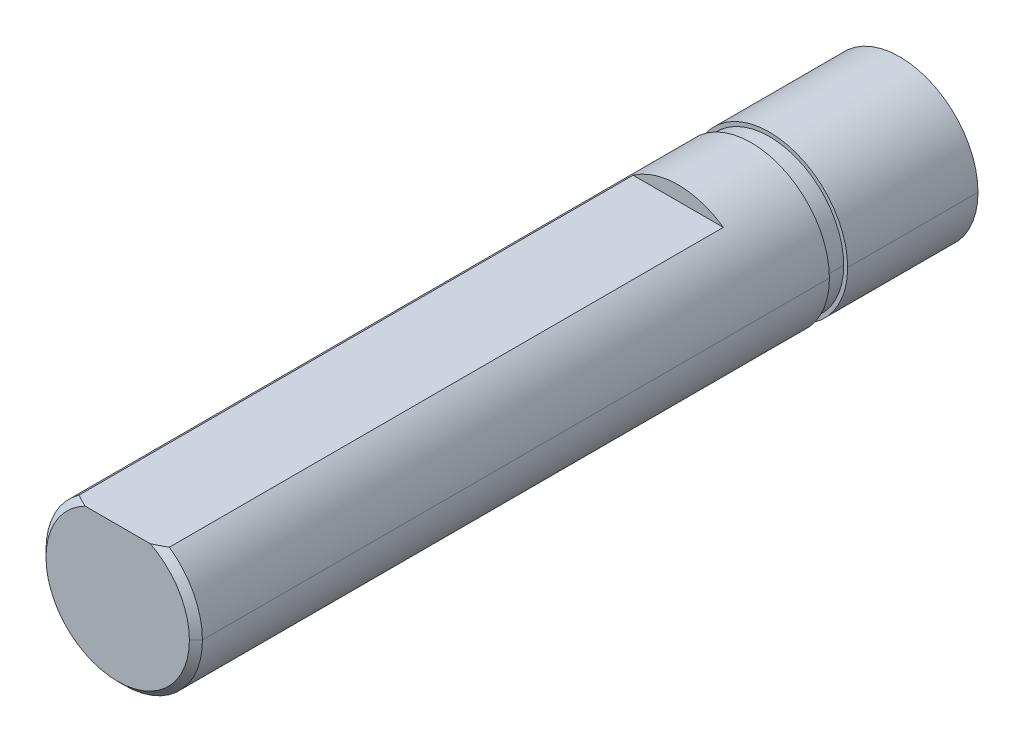
ISO-10303-21;
HEADER;
FILE_DESCRIPTION(('STEP AP214'),'2;1');
FILE_NAME('part.step','',(''),(''),'','','');
FILE_SCHEMA(('AUTOMOTIVE_DESIGN { 1 0 10303 214 1 1 1 1 }'));
ENDSEC;
DATA;
#1=APPLICATION_CONTEXT('core data for automotive mechanical design processes');
#2=APPLICATION_PROTOCOL_DEFINITION('international standard','automotive_design',2000,#1);
#3=PRODUCT_CONTEXT('',#1,'mechanical');
#4=PRODUCT('Part','Part','',(#3));
#5=PRODUCT_RELATED_PRODUCT_CATEGORY('part','',(#4));
#6=PRODUCT_DEFINITION_FORMATION('','',#4);
#7=PRODUCT_DEFINITION_CONTEXT('part definition',#1,'design');
#8=PRODUCT_DEFINITION('design','',#6,#7);
#9=PRODUCT_DEFINITION_SHAPE('','',#8);
#10=(LENGTH_UNIT() NAMED_UNIT(*) SI_UNIT(.MILLI.,.METRE.));
#11=(NAMED_UNIT(*) PLANE_ANGLE_UNIT() SI_UNIT($,.RADIAN.));
#12=(NAMED_UNIT(*) SI_UNIT($,.STERADIAN.) SOLID_ANGLE_UNIT());
#13=UNCERTAINTY_MEASURE_WITH_UNIT(LENGTH_MEASURE(1.E-05),#10,'distance_accuracy_value','');
#14=(GEOMETRIC_REPRESENTATION_CONTEXT(3) GLOBAL_UNCERTAINTY_ASSIGNED_CONTEXT((#13)) GLOBAL_UNIT_ASSIGNED_CONTEXT((#10,
#11,#12)) REPRESENTATION_CONTEXT('',''));
#15=CARTESIAN_POINT('',(0.,0.,0.));
#16=DIRECTION('',(0.,0.,1.));
#17=DIRECTION('',(1.,0.,0.));
#18=AXIS2_PLACEMENT_3D('',#15,#16,#17);
#19=CARTESIAN_POINT('',(0.,0.,30.));
#20=DIRECTION('',(0.,0.,-1.));
#21=DIRECTION('',(-1.,0.,0.));
#22=AXIS2_PLACEMENT_3D('',#19,#20,#21);
#23=CYLINDRICAL_SURFACE('',#22,3.);
#24=CARTESIAN_POINT('',(0.,0.,5.));
#25=DIRECTION('',(0.,0.,-1.));
#26=DIRECTION('',(-1.,0.,0.));
#27=AXIS2_PLACEMENT_3D('',#24,#25,#26);
#28=CIRCLE('',#27,3.);
#29=CARTESIAN_POINT('',(-3.,0.,5.));
#30=VERTEX_POINT('',#29);
#31=CARTESIAN_POINT('',(3.,0.,5.));
#32=VERTEX_POINT('',#31);
#33=EDGE_CURVE('E11',#30,#32,#28,.T.);
#34=ORIENTED_EDGE('',*,*,#33,.T.);
#35=DIRECTION('',(0.,0.,-1.));
#36=VECTOR('',#35,1.);
#37=CARTESIAN_POINT('',(3.,0.,30.));
#38=LINE('',#37,#36);
#39=CARTESIAN_POINT('',(3.,0.,0.));
#40=VERTEX_POINT('',#39);
#41=EDGE_CURVE('E27',#32,#40,#38,.T.);
#42=ORIENTED_EDGE('',*,*,#41,.T.);
#43=CARTESIAN_POINT('',(0.,0.,0.));
#44=DIRECTION('',(0.,0.,1.));
#45=DIRECTION('',(1.,0.,0.));
#46=AXIS2_PLACEMENT_3D('',#43,#44,#45);
#47=CIRCLE('',#46,3.);
#48=CARTESIAN_POINT('',(-3.,0.,0.));
#49=VERTEX_POINT('',#48);
#50=EDGE_CURVE('E159',#40,#49,#47,.T.);
#51=ORIENTED_EDGE('',*,*,#50,.T.);
#52=DIRECTION('',(0.,0.,-1.));
#53=VECTOR('',#52,1.);
#54=CARTESIAN_POINT('',(-3.,0.,30.));
#55=LINE('',#54,#53);
#56=EDGE_CURVE('E134',#30,#49,#55,.T.);
#57=ORIENTED_EDGE('',*,*,#56,.F.);
#58=EDGE_LOOP('',(#34,#42,#51,#57));
#59=FACE_BOUND('',#58,.T.);
#60=ADVANCED_FACE('F16',(#59),#23,.T.);
#61=CARTESIAN_POINT('',(0.,0.,0.));
#62=DIRECTION('',(0.,0.,1.));
#63=DIRECTION('',(1.,0.,0.));
#64=AXIS2_PLACEMENT_3D('',#61,#62,#63);
#65=CYLINDRICAL_SURFACE('',#64,2.85);
#66=CARTESIAN_POINT('',(0.,0.,5.));
#67=DIRECTION('',(0.,0.,1.));
#68=DIRECTION('',(1.,0.,0.));
#69=AXIS2_PLACEMENT_3D('',#66,#67,#68);
#70=CIRCLE('',#69,2.85);
#71=CARTESIAN_POINT('',(2.85,0.,5.));
#72=VERTEX_POINT('',#71);
#73=CARTESIAN_POINT('',(-2.85,0.,5.));
#74=VERTEX_POINT('',#73);
#75=EDGE_CURVE('E163',#72,#74,#70,.T.);
#76=ORIENTED_EDGE('',*,*,#75,.T.);
#77=DIRECTION('',(0.,0.,1.));
#78=VECTOR('',#77,1.);
#79=CARTESIAN_POINT('',(-2.85,0.,0.));
#80=LINE('',#79,#78);
#81=CARTESIAN_POINT('',(-2.85,0.,5.7));
#82=VERTEX_POINT('',#81);
#83=EDGE_CURVE('E116',#74,#82,#80,.T.);
#84=ORIENTED_EDGE('',*,*,#83,.T.);
#85=CARTESIAN_POINT('',(0.,0.,5.7));
#86=DIRECTION('',(0.,0.,1.));
#87=DIRECTION('',(1.,0.,0.));
#88=AXIS2_PLACEMENT_3D('',#85,#86,#87);
#89=CIRCLE('',#88,2.85);
#90=CARTESIAN_POINT('',(2.85,0.,5.7));
#91=VERTEX_POINT('',#90);
#92=EDGE_CURVE('E114',#91,#82,#89,.T.);
#93=ORIENTED_EDGE('',*,*,#92,.F.);
#94=DIRECTION('',(0.,0.,1.));
#95=VECTOR('',#94,1.);
#96=CARTESIAN_POINT('',(2.85,0.,0.));
#97=LINE('',#96,#95);
#98=EDGE_CURVE('E100',#72,#91,#97,.T.);
#99=ORIENTED_EDGE('',*,*,#98,.F.);
#100=EDGE_LOOP('',(#76,#84,#93,#99));
#101=FACE_BOUND('',#100,.T.);
#102=ADVANCED_FACE('F115',(#101),#65,.T.);
#103=CARTESIAN_POINT('',(0.,0.,30.));
#104=DIRECTION('',(0.,0.,-1.));
#105=DIRECTION('',(-1.,0.,0.));
#106=AXIS2_PLACEMENT_3D('',#103,#104,#105);
#107=CONICAL_SURFACE('',#106,2.75,0.78539816339745);
#108=CARTESIAN_POINT('',(0.,0.,30.));
#109=DIRECTION('',(0.,0.,1.));
#110=DIRECTION('',(1.,0.,0.));
#111=AXIS2_PLACEMENT_3D('',#108,#109,#110);
#112=CIRCLE('',#111,2.75);
#113=CARTESIAN_POINT('',(2.75,0.,30.));
#114=VERTEX_POINT('',#113);
#115=CARTESIAN_POINT('',(1.24899959967967,2.45,30.));
#116=VERTEX_POINT('',#115);
#117=EDGE_CURVE('E156',#114,#116,#112,.T.);
#118=ORIENTED_EDGE('',*,*,#117,.F.);
#119=DIRECTION('',(0.707106781186549,0.,-0.707106781186546));
#120=VECTOR('',#119,1.);
#121=CARTESIAN_POINT('',(2.75,0.,30.));
#122=LINE('',#121,#120);
#123=CARTESIAN_POINT('',(3.,0.,29.75));
#124=VERTEX_POINT('',#123);
#125=EDGE_CURVE('E141',#114,#124,#122,.T.);
#126=ORIENTED_EDGE('',*,*,#125,.T.);
#127=CARTESIAN_POINT('',(0.,0.,29.75));
#128=DIRECTION('',(0.,0.,-1.));
#129=DIRECTION('',(1.,0.,0.));
#130=AXIS2_PLACEMENT_3D('',#127,#128,#129);
#131=CIRCLE('',#130,3.);
#132=CARTESIAN_POINT('',(1.73132896931808,2.45,29.75));
#133=VERTEX_POINT('',#132);
#134=EDGE_CURVE('E142',#133,#124,#131,.T.);
#135=ORIENTED_EDGE('',*,*,#134,.F.);
#136=CARTESIAN_POINT('',(1.24899959967967,2.45,30.));
#137=CARTESIAN_POINT('',(1.47967886341983,2.45,29.8952297061578));
#138=CARTESIAN_POINT('',(1.73132896931808,2.45,29.75));
#139=B_SPLINE_CURVE_WITH_KNOTS('',2,(#136,#137,#138),.UNSPECIFIED.,.F.,.F.,(3,3),(0.,1.),.UNSPECIFIED.);
#140=EDGE_CURVE('E188',#116,#133,#139,.T.);
#141=ORIENTED_EDGE('',*,*,#140,.F.);
#142=EDGE_LOOP('',(#118,#126,#135,#141));
#143=FACE_BOUND('',#142,.T.);
#144=ADVANCED_FACE('F330',(#143),#107,.T.);
#145=CARTESIAN_POINT('',(0.,0.,30.));
#146=DIRECTION('',(0.,0.,-1.));
#147=DIRECTION('',(-1.,0.,0.));
#148=AXIS2_PLACEMENT_3D('',#145,#146,#147);
#149=CONICAL_SURFACE('',#148,2.75,0.78539816339745);
#150=ORIENTED_EDGE('',*,*,#125,.F.);
#151=CARTESIAN_POINT('',(0.,0.,30.));
#152=DIRECTION('',(0.,0.,1.));
#153=DIRECTION('',(1.,0.,0.));
#154=AXIS2_PLACEMENT_3D('',#151,#152,#153);
#155=CIRCLE('',#154,2.75);
#156=CARTESIAN_POINT('',(-2.75,0.,30.));
#157=VERTEX_POINT('',#156);
#158=EDGE_CURVE('E152',#157,#114,#155,.T.);
#159=ORIENTED_EDGE('',*,*,#158,.F.);
#160=DIRECTION('',(-0.707106781186549,0.,-0.707106781186546));
#161=VECTOR('',#160,1.);
#162=CARTESIAN_POINT('',(-2.75,0.,30.));
#163=LINE('',#162,#161);
#164=CARTESIAN_POINT('',(-3.,0.,29.75));
#165=VERTEX_POINT('',#164);
#166=EDGE_CURVE('E138',#157,#165,#163,.T.);
#167=ORIENTED_EDGE('',*,*,#166,.T.);
#168=CARTESIAN_POINT('',(0.,0.,29.75));
#169=DIRECTION('',(0.,0.,-1.));
#170=DIRECTION('',(1.,0.,0.));
#171=AXIS2_PLACEMENT_3D('',#168,#169,#170);
#172=CIRCLE('',#171,3.);
#173=EDGE_CURVE('E174',#124,#165,#172,.T.);
#174=ORIENTED_EDGE('',*,*,#173,.F.);
#175=EDGE_LOOP('',(#150,#159,#167,#174));
#176=FACE_BOUND('',#175,.T.);
#177=ADVANCED_FACE('F18',(#176),#149,.T.);
#178=CARTESIAN_POINT('',(0.,0.,30.));
#179=DIRECTION('',(0.,0.,-1.));
#180=DIRECTION('',(-1.,0.,0.));
#181=AXIS2_PLACEMENT_3D('',#178,#179,#180);
#182=CYLINDRICAL_SURFACE('',#181,3.);
#183=ORIENTED_EDGE('',*,*,#134,.T.);
#184=DIRECTION('',(0.,0.,-1.));
#185=VECTOR('',#184,1.);
#186=CARTESIAN_POINT('',(3.,0.,30.));
#187=LINE('',#186,#185);
#188=CARTESIAN_POINT('',(3.,0.,5.7));
#189=VERTEX_POINT('',#188);
#190=EDGE_CURVE('E166',#124,#189,#187,.T.);
#191=ORIENTED_EDGE('',*,*,#190,.T.);
#192=CARTESIAN_POINT('',(0.,0.,5.7));
#193=DIRECTION('',(0.,0.,1.));
#194=DIRECTION('',(1.,0.,0.));
#195=AXIS2_PLACEMENT_3D('',#192,#193,#194);
#196=CIRCLE('',#195,3.);
#197=CARTESIAN_POINT('',(-3.,0.,5.7));
#198=VERTEX_POINT('',#197);
#199=EDGE_CURVE('E170',#189,#198,#196,.T.);
#200=ORIENTED_EDGE('',*,*,#199,.T.);
#201=DIRECTION('',(0.,0.,-1.));
#202=VECTOR('',#201,1.);
#203=CARTESIAN_POINT('',(-3.,0.,30.));
#204=LINE('',#203,#202);
#205=EDGE_CURVE('E149',#165,#198,#204,.T.);
#206=ORIENTED_EDGE('',*,*,#205,.F.);
#207=CARTESIAN_POINT('',(0.,0.,29.75));
#208=DIRECTION('',(0.,0.,-1.));
#209=DIRECTION('',(1.,0.,0.));
#210=AXIS2_PLACEMENT_3D('',#207,#208,#209);
#211=CIRCLE('',#210,3.);
#212=CARTESIAN_POINT('',(-1.73132896931808,2.45,29.75));
#213=VERTEX_POINT('',#212);
#214=EDGE_CURVE('E181',#165,#213,#211,.T.);
#215=ORIENTED_EDGE('',*,*,#214,.T.);
#216=DIRECTION('',(0.,0.,1.));
#217=VECTOR('',#216,1.);
#218=CARTESIAN_POINT('',(-1.73132896931808,2.45,8.5));
#219=LINE('',#218,#217);
#220=CARTESIAN_POINT('',(-1.73132896931808,2.45,8.5));
#221=VERTEX_POINT('',#220);
#222=EDGE_CURVE('E234',#221,#213,#219,.T.);
#223=ORIENTED_EDGE('',*,*,#222,.F.);
#224=CARTESIAN_POINT('',(0.,0.,8.5));
#225=DIRECTION('',(0.,0.,1.));
#226=DIRECTION('',(1.,0.,0.));
#227=AXIS2_PLACEMENT_3D('',#224,#225,#226);
#228=CIRCLE('',#227,3.);
#229=CARTESIAN_POINT('',(1.73132896931808,2.45,8.5));
#230=VERTEX_POINT('',#229);
#231=EDGE_CURVE('E132',#230,#221,#228,.T.);
#232=ORIENTED_EDGE('',*,*,#231,.F.);
#233=DIRECTION('',(0.,0.,1.));
#234=VECTOR('',#233,1.);
#235=CARTESIAN_POINT('',(1.73132896931808,2.45,8.5));
#236=LINE('',#235,#234);
#237=EDGE_CURVE('E247',#230,#133,#236,.T.);
#238=ORIENTED_EDGE('',*,*,#237,.T.);
#239=EDGE_LOOP('',(#183,#191,#200,#206,#215,#223,#232,#238));
#240=FACE_BOUND('',#239,.T.);
#241=ADVANCED_FACE('F207',(#240),#182,.T.);
#242=CARTESIAN_POINT('',(0.,0.,30.));
#243=DIRECTION('',(0.,0.,-1.));
#244=DIRECTION('',(-1.,0.,0.));
#245=AXIS2_PLACEMENT_3D('',#242,#243,#244);
#246=CYLINDRICAL_SURFACE('',#245,3.);
#247=ORIENTED_EDGE('',*,*,#190,.F.);
#248=ORIENTED_EDGE('',*,*,#173,.T.);
#249=ORIENTED_EDGE('',*,*,#205,.T.);
#250=CARTESIAN_POINT('',(0.,0.,5.7));
#251=DIRECTION('',(0.,0.,1.));
#252=DIRECTION('',(1.,0.,0.));
#253=AXIS2_PLACEMENT_3D('',#250,#251,#252);
#254=CIRCLE('',#253,3.);
#255=EDGE_CURVE('E146',#198,#189,#254,.T.);
#256=ORIENTED_EDGE('',*,*,#255,.T.);
#257=EDGE_LOOP('',(#247,#248,#249,#256));
#258=FACE_BOUND('',#257,.T.);
#259=ADVANCED_FACE('F333',(#258),#246,.T.);
#260=CARTESIAN_POINT('',(0.,0.,30.));
#261=DIRECTION('',(0.,0.,1.));
#262=DIRECTION('',(1.,0.,0.));
#263=AXIS2_PLACEMENT_3D('',#260,#261,#262);
#264=PLANE('',#263);
#265=DIRECTION('',(1.,0.,0.));
#266=VECTOR('',#265,1.);
#267=CARTESIAN_POINT('',(-1.73132896931808,2.45,30.));
#268=LINE('',#267,#266);
#269=CARTESIAN_POINT('',(-1.24899959967967,2.45,30.));
#270=VERTEX_POINT('',#269);
#271=EDGE_CURVE('E258',#270,#116,#268,.T.);
#272=ORIENTED_EDGE('',*,*,#271,.F.);
#273=CARTESIAN_POINT('',(0.,0.,30.));
#274=DIRECTION('',(0.,0.,1.));
#275=DIRECTION('',(1.,0.,0.));
#276=AXIS2_PLACEMENT_3D('',#273,#274,#275);
#277=CIRCLE('',#276,2.75);
#278=EDGE_CURVE('E150',#270,#157,#277,.T.);
#279=ORIENTED_EDGE('',*,*,#278,.T.);
#280=ORIENTED_EDGE('',*,*,#158,.T.);
#281=ORIENTED_EDGE('',*,*,#117,.T.);
#282=EDGE_LOOP('',(#272,#279,#280,#281));
#283=FACE_BOUND('',#282,.T.);
#284=ADVANCED_FACE('F206',(#283),#264,.T.);
#285=CARTESIAN_POINT('',(-1.73132896931808,2.45,8.5));
#286=DIRECTION('',(0.,-1.,0.));
#287=DIRECTION('',(0.,0.,-1.));
#288=AXIS2_PLACEMENT_3D('',#285,#286,#287);
#289=PLANE('',#288);
#290=ORIENTED_EDGE('',*,*,#271,.T.);
#291=ORIENTED_EDGE('',*,*,#140,.T.);
#292=ORIENTED_EDGE('',*,*,#237,.F.);
#293=DIRECTION('',(1.,0.,0.));
#294=VECTOR('',#293,1.);
#295=CARTESIAN_POINT('',(-1.73132896931808,2.45,8.5));
#296=LINE('',#295,#294);
#297=EDGE_CURVE('E119',#221,#230,#296,.T.);
#298=ORIENTED_EDGE('',*,*,#297,.F.);
#299=ORIENTED_EDGE('',*,*,#222,.T.);
#300=CARTESIAN_POINT('',(-1.73132896931808,2.45,29.75));
#301=CARTESIAN_POINT('',(-1.47967886341983,2.45,29.8952297061578));
#302=CARTESIAN_POINT('',(-1.24899959967967,2.45,30.));
#303=B_SPLINE_CURVE_WITH_KNOTS('',2,(#300,#301,#302),.UNSPECIFIED.,.F.,.F.,(3,3),(0.,1.),.UNSPECIFIED.);
#304=EDGE_CURVE('E230',#213,#270,#303,.T.);
#305=ORIENTED_EDGE('',*,*,#304,.T.);
#306=EDGE_LOOP('',(#290,#291,#292,#298,#299,#305));
#307=FACE_BOUND('',#306,.T.);
#308=ADVANCED_FACE('F195',(#307),#289,.F.);
#309=CARTESIAN_POINT('',(0.,0.,8.5));
#310=DIRECTION('',(0.,0.,1.));
#311=DIRECTION('',(1.,0.,0.));
#312=AXIS2_PLACEMENT_3D('',#309,#310,#311);
#313=PLANE('',#312);
#314=ORIENTED_EDGE('',*,*,#231,.T.);
#315=ORIENTED_EDGE('',*,*,#297,.T.);
#316=EDGE_LOOP('',(#314,#315));
#317=FACE_BOUND('',#316,.T.);
#318=ADVANCED_FACE('F205',(#317),#313,.T.);
#319=CARTESIAN_POINT('',(0.,0.,30.));
#320=DIRECTION('',(0.,0.,-1.));
#321=DIRECTION('',(-1.,0.,0.));
#322=AXIS2_PLACEMENT_3D('',#319,#320,#321);
#323=CONICAL_SURFACE('',#322,2.75,0.78539816339745);
#324=ORIENTED_EDGE('',*,*,#166,.F.);
#325=ORIENTED_EDGE('',*,*,#278,.F.);
#326=ORIENTED_EDGE('',*,*,#304,.F.);
#327=ORIENTED_EDGE('',*,*,#214,.F.);
#328=EDGE_LOOP('',(#324,#325,#326,#327));
#329=FACE_BOUND('',#328,.T.);
#330=ADVANCED_FACE('F209',(#329),#323,.T.);
#331=CARTESIAN_POINT('',(0.,-3.15,5.));
#332=DIRECTION('',(0.,0.,-1.));
#333=DIRECTION('',(0.,-1.,0.));
#334=AXIS2_PLACEMENT_3D('',#331,#332,#333);
#335=PLANE('',#334);
#336=ORIENTED_EDGE('',*,*,#33,.F.);
#337=CARTESIAN_POINT('',(0.,0.,5.));
#338=DIRECTION('',(0.,0.,-1.));
#339=DIRECTION('',(-1.,0.,0.));
#340=AXIS2_PLACEMENT_3D('',#337,#338,#339);
#341=CIRCLE('',#340,3.);
#342=EDGE_CURVE('E111',#32,#30,#341,.T.);
#343=ORIENTED_EDGE('',*,*,#342,.F.);
#344=EDGE_LOOP('',(#336,#343));
#345=FACE_BOUND('',#344,.T.);
#346=ORIENTED_EDGE('',*,*,#75,.F.);
#347=CARTESIAN_POINT('',(0.,0.,5.));
#348=DIRECTION('',(0.,0.,1.));
#349=DIRECTION('',(1.,0.,0.));
#350=AXIS2_PLACEMENT_3D('',#347,#348,#349);
#351=CIRCLE('',#350,2.85);
#352=EDGE_CURVE('E106',#74,#72,#351,.T.);
#353=ORIENTED_EDGE('',*,*,#352,.F.);
#354=EDGE_LOOP('',(#346,#353));
#355=FACE_BOUND('',#354,.T.);
#356=ADVANCED_FACE('F311',(#345,#355),#335,.F.);
#357=CARTESIAN_POINT('',(0.,-3.15,5.7));
#358=DIRECTION('',(0.,0.,1.));
#359=DIRECTION('',(1.,0.,0.));
#360=AXIS2_PLACEMENT_3D('',#357,#358,#359);
#361=PLANE('',#360);
#362=ORIENTED_EDGE('',*,*,#255,.F.);
#363=ORIENTED_EDGE('',*,*,#199,.F.);
#364=EDGE_LOOP('',(#362,#363));
#365=FACE_BOUND('',#364,.T.);
#366=ORIENTED_EDGE('',*,*,#92,.T.);
#367=CARTESIAN_POINT('',(0.,0.,5.7));
#368=DIRECTION('',(0.,0.,1.));
#369=DIRECTION('',(1.,0.,0.));
#370=AXIS2_PLACEMENT_3D('',#367,#368,#369);
#371=CIRCLE('',#370,2.85);
#372=EDGE_CURVE('E104',#82,#91,#371,.T.);
#373=ORIENTED_EDGE('',*,*,#372,.T.);
#374=EDGE_LOOP('',(#366,#373));
#375=FACE_BOUND('',#374,.T.);
#376=ADVANCED_FACE('F121',(#365,#375),#361,.F.);
#377=CARTESIAN_POINT('',(0.,0.,0.));
#378=DIRECTION('',(0.,0.,1.));
#379=DIRECTION('',(1.,0.,0.));
#380=AXIS2_PLACEMENT_3D('',#377,#378,#379);
#381=CYLINDRICAL_SURFACE('',#380,2.85);
#382=ORIENTED_EDGE('',*,*,#83,.F.);
#383=ORIENTED_EDGE('',*,*,#352,.T.);
#384=ORIENTED_EDGE('',*,*,#98,.T.);
#385=ORIENTED_EDGE('',*,*,#372,.F.);
#386=EDGE_LOOP('',(#382,#383,#384,#385));
#387=FACE_BOUND('',#386,.T.);
#388=ADVANCED_FACE('F102',(#387),#381,.T.);
#389=CARTESIAN_POINT('',(0.,0.,0.));
#390=DIRECTION('',(0.,0.,1.));
#391=DIRECTION('',(1.,0.,0.));
#392=AXIS2_PLACEMENT_3D('',#389,#390,#391);
#393=PLANE('',#392);
#394=CARTESIAN_POINT('',(0.,0.,0.));
#395=DIRECTION('',(0.,0.,1.));
#396=DIRECTION('',(1.,0.,0.));
#397=AXIS2_PLACEMENT_3D('',#394,#395,#396);
#398=CIRCLE('',#397,3.);
#399=EDGE_CURVE('E137',#49,#40,#398,.T.);
#400=ORIENTED_EDGE('',*,*,#399,.F.);
#401=ORIENTED_EDGE('',*,*,#50,.F.);
#402=EDGE_LOOP('',(#400,#401));
#403=FACE_BOUND('',#402,.T.);
#404=ADVANCED_FACE('F316',(#403),#393,.F.);
#405=CARTESIAN_POINT('',(0.,0.,30.));
#406=DIRECTION('',(0.,0.,-1.));
#407=DIRECTION('',(-1.,0.,0.));
#408=AXIS2_PLACEMENT_3D('',#405,#406,#407);
#409=CYLINDRICAL_SURFACE('',#408,3.);
#410=ORIENTED_EDGE('',*,*,#41,.F.);
#411=ORIENTED_EDGE('',*,*,#342,.T.);
#412=ORIENTED_EDGE('',*,*,#56,.T.);
#413=ORIENTED_EDGE('',*,*,#399,.T.);
#414=EDGE_LOOP('',(#410,#411,#412,#413));
#415=FACE_BOUND('',#414,.T.);
#416=ADVANCED_FACE('F308',(#415),#409,.T.);
#417=CLOSED_SHELL('',(#60,#102,#144,#177,#241,#259,#284,#308,#318,#330,#356,#376,#388,#404,#416));
#418=MANIFOLD_SOLID_BREP('B1',#417);
#419=ADVANCED_BREP_SHAPE_REPRESENTATION('',(#18,#418),#14);
#420=SHAPE_DEFINITION_REPRESENTATION(#9,#419);
ENDSEC;
END-ISO-10303-21;
